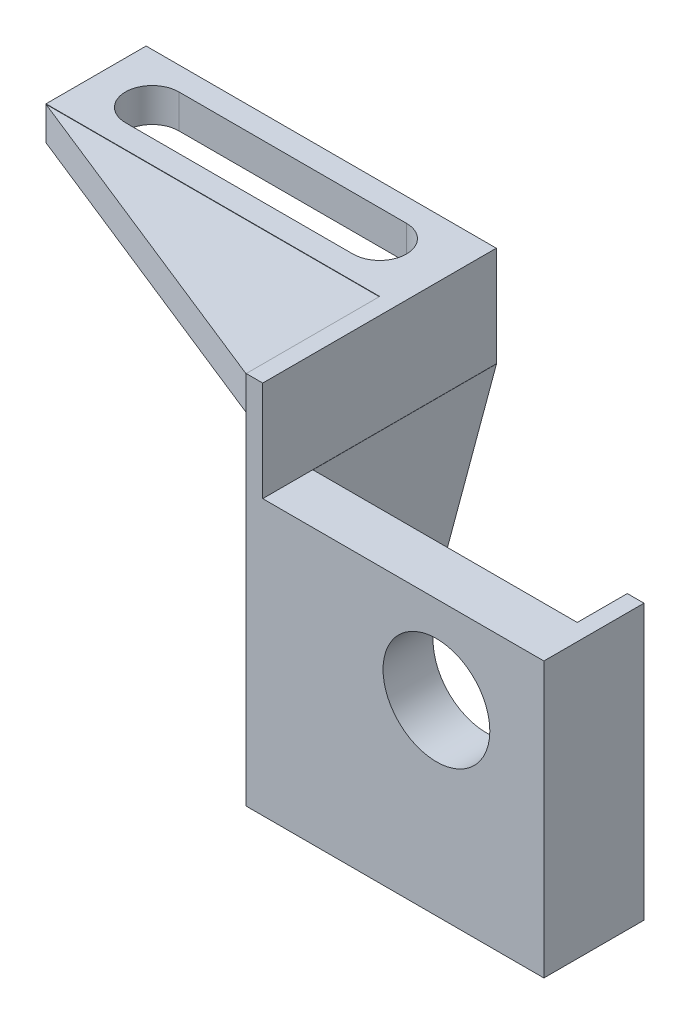
ISO-10303-21;
HEADER;
FILE_DESCRIPTION(('STEP AP214'),'2;1');
FILE_NAME('part.step','',(''),(''),'','','');
FILE_SCHEMA(('AUTOMOTIVE_DESIGN { 1 0 10303 214 1 1 1 1 }'));
ENDSEC;
DATA;
#1=APPLICATION_CONTEXT('core data for automotive mechanical design processes');
#2=APPLICATION_PROTOCOL_DEFINITION('international standard','automotive_design',2000,#1);
#3=PRODUCT_CONTEXT('',#1,'mechanical');
#4=PRODUCT('Part','Part','',(#3));
#5=PRODUCT_RELATED_PRODUCT_CATEGORY('part','',(#4));
#6=PRODUCT_DEFINITION_FORMATION('','',#4);
#7=PRODUCT_DEFINITION_CONTEXT('part definition',#1,'design');
#8=PRODUCT_DEFINITION('design','',#6,#7);
#9=PRODUCT_DEFINITION_SHAPE('','',#8);
#10=(LENGTH_UNIT() NAMED_UNIT(*) SI_UNIT(.MILLI.,.METRE.));
#11=(NAMED_UNIT(*) PLANE_ANGLE_UNIT() SI_UNIT($,.RADIAN.));
#12=(NAMED_UNIT(*) SI_UNIT($,.STERADIAN.) SOLID_ANGLE_UNIT());
#13=UNCERTAINTY_MEASURE_WITH_UNIT(LENGTH_MEASURE(1.E-05),#10,'distance_accuracy_value','');
#14=(GEOMETRIC_REPRESENTATION_CONTEXT(3) GLOBAL_UNCERTAINTY_ASSIGNED_CONTEXT((#13)) GLOBAL_UNIT_ASSIGNED_CONTEXT((#10,
#11,#12)) REPRESENTATION_CONTEXT('',''));
#15=CARTESIAN_POINT('',(0.,0.,0.));
#16=DIRECTION('',(0.,0.,1.));
#17=DIRECTION('',(1.,0.,0.));
#18=AXIS2_PLACEMENT_3D('',#15,#16,#17);
#19=CARTESIAN_POINT('',(-10.5238211552799,0.,0.));
#20=DIRECTION('',(-1.,0.,0.));
#21=DIRECTION('',(0.,-1.,0.));
#22=AXIS2_PLACEMENT_3D('',#19,#20,#21);
#23=PLANE('',#22);
#24=DIRECTION('',(0.,1.,0.));
#25=VECTOR('',#24,1.);
#26=CARTESIAN_POINT('',(-10.5238211552799,7.3452534562212,3.));
#27=LINE('',#26,#25);
#28=CARTESIAN_POINT('',(-10.5238211552799,-9.1097465437788,3.));
#29=VERTEX_POINT('',#28);
#30=CARTESIAN_POINT('',(-10.5238211552799,11.3211667033944,3.));
#31=VERTEX_POINT('',#30);
#32=EDGE_CURVE('E284',#29,#31,#27,.T.);
#33=ORIENTED_EDGE('',*,*,#32,.T.);
#34=DIRECTION('',(0.,0.,1.));
#35=VECTOR('',#34,1.);
#36=CARTESIAN_POINT('',(-10.5238211552799,11.3211667033944,-11.));
#37=LINE('',#36,#35);
#38=CARTESIAN_POINT('',(-10.5238211552799,11.3211667033944,-11.));
#39=VERTEX_POINT('',#38);
#40=EDGE_CURVE('E204',#39,#31,#37,.T.);
#41=ORIENTED_EDGE('',*,*,#40,.F.);
#42=DIRECTION('',(0.,1.,0.));
#43=VECTOR('',#42,1.);
#44=CARTESIAN_POINT('',(-10.5238211552799,13.3452534562212,-11.));
#45=LINE('',#44,#43);
#46=CARTESIAN_POINT('',(-10.5238211552799,7.3452534562212,-11.));
#47=VERTEX_POINT('',#46);
#48=EDGE_CURVE('E242',#47,#39,#45,.T.);
#49=ORIENTED_EDGE('',*,*,#48,.F.);
#50=DIRECTION('',(0.,-0.939493001584619,0.342568095381812));
#51=VECTOR('',#50,1.);
#52=CARTESIAN_POINT('',(-10.5238211552799,7.3452534562212,-11.));
#53=LINE('',#52,#51);
#54=CARTESIAN_POINT('',(-10.5238211552799,-9.1097465437788,-5.));
#55=VERTEX_POINT('',#54);
#56=EDGE_CURVE('E223',#47,#55,#53,.T.);
#57=ORIENTED_EDGE('',*,*,#56,.T.);
#58=DIRECTION('',(0.,0.,1.));
#59=VECTOR('',#58,1.);
#60=CARTESIAN_POINT('',(-10.5238211552799,-9.1097465437788,0.));
#61=LINE('',#60,#59);
#62=EDGE_CURVE('E279',#55,#29,#61,.T.);
#63=ORIENTED_EDGE('',*,*,#62,.T.);
#64=EDGE_LOOP('',(#33,#41,#49,#57,#63));
#65=FACE_BOUND('',#64,.T.);
#66=ADVANCED_FACE('F47',(#65),#23,.T.);
#67=CARTESIAN_POINT('',(0.,0.,0.));
#68=DIRECTION('',(0.,0.,1.));
#69=DIRECTION('',(1.,0.,0.));
#70=AXIS2_PLACEMENT_3D('',#67,#68,#69);
#71=PLANE('',#70);
#72=CARTESIAN_POINT('',(0.876178844720053,2.0902534562212,0.));
#73=DIRECTION('',(0.,0.,1.));
#74=DIRECTION('',(1.,0.,0.));
#75=AXIS2_PLACEMENT_3D('',#72,#73,#74);
#76=CIRCLE('',#75,3.2);
#77=CARTESIAN_POINT('',(4.07617884472005,2.0902534562212,0.));
#78=VERTEX_POINT('',#77);
#79=EDGE_CURVE('E297',#78,#78,#76,.T.);
#80=ORIENTED_EDGE('',*,*,#79,.T.);
#81=EDGE_LOOP('',(#80));
#82=FACE_BOUND('',#81,.T.);
#83=CARTESIAN_POINT('',(0.876178844720052,-6.0797465437788,0.));
#84=DIRECTION('',(0.,0.,1.));
#85=DIRECTION('',(1.,0.,0.));
#86=AXIS2_PLACEMENT_3D('',#83,#84,#85);
#87=CIRCLE('',#86,1.65);
#88=CARTESIAN_POINT('',(2.52617884472005,-6.0797465437788,0.));
#89=VERTEX_POINT('',#88);
#90=EDGE_CURVE('E11',#89,#89,#87,.F.);
#91=ORIENTED_EDGE('',*,*,#90,.F.);
#92=EDGE_LOOP('',(#91));
#93=FACE_BOUND('',#92,.T.);
#94=DIRECTION('',(0.,1.,0.));
#95=VECTOR('',#94,1.);
#96=CARTESIAN_POINT('',(6.31617884472005,7.3452534562212,0.));
#97=LINE('',#96,#95);
#98=CARTESIAN_POINT('',(6.31617884472005,-9.1097465437788,0.));
#99=VERTEX_POINT('',#98);
#100=CARTESIAN_POINT('',(6.31617884472005,7.3452534562212,0.));
#101=VERTEX_POINT('',#100);
#102=EDGE_CURVE('E327',#99,#101,#97,.T.);
#103=ORIENTED_EDGE('',*,*,#102,.F.);
#104=DIRECTION('',(1.,0.,0.));
#105=VECTOR('',#104,1.);
#106=CARTESIAN_POINT('',(-6.52382115527995,-9.1097465437788,0.));
#107=LINE('',#106,#105);
#108=CARTESIAN_POINT('',(-9.52382115527995,-9.1097465437788,0.));
#109=VERTEX_POINT('',#108);
#110=EDGE_CURVE('E293',#109,#99,#107,.T.);
#111=ORIENTED_EDGE('',*,*,#110,.F.);
#112=DIRECTION('',(0.,-1.,0.));
#113=VECTOR('',#112,1.);
#114=CARTESIAN_POINT('',(-9.52382115527995,7.3452534562212,0.));
#115=LINE('',#114,#113);
#116=CARTESIAN_POINT('',(-9.52382115527995,7.3452534562212,0.));
#117=VERTEX_POINT('',#116);
#118=EDGE_CURVE('E265',#117,#109,#115,.T.);
#119=ORIENTED_EDGE('',*,*,#118,.F.);
#120=DIRECTION('',(-1.,0.,0.));
#121=VECTOR('',#120,1.);
#122=CARTESIAN_POINT('',(-6.52382115527995,7.3452534562212,0.));
#123=LINE('',#122,#121);
#124=EDGE_CURVE('E304',#101,#117,#123,.T.);
#125=ORIENTED_EDGE('',*,*,#124,.F.);
#126=EDGE_LOOP('',(#103,#111,#119,#125));
#127=FACE_BOUND('',#126,.T.);
#128=ADVANCED_FACE('F326',(#82,#93,#127),#71,.F.);
#129=CARTESIAN_POINT('',(-6.52382115527995,7.3452534562212,3.));
#130=DIRECTION('',(0.,-1.,0.));
#131=DIRECTION('',(0.,0.,-1.));
#132=AXIS2_PLACEMENT_3D('',#129,#130,#131);
#133=PLANE('',#132);
#134=DIRECTION('',(0.,0.,-1.));
#135=VECTOR('',#134,1.);
#136=CARTESIAN_POINT('',(-9.53552980491728,7.3452534562212,-5.));
#137=LINE('',#136,#135);
#138=CARTESIAN_POINT('',(-9.53552980491728,7.3452534562212,3.));
#139=VERTEX_POINT('',#138);
#140=CARTESIAN_POINT('',(-9.53552980491728,7.3452534562212,-11.));
#141=VERTEX_POINT('',#140);
#142=EDGE_CURVE('E250',#139,#141,#137,.T.);
#143=ORIENTED_EDGE('',*,*,#142,.F.);
#144=DIRECTION('',(-1.,0.,0.));
#145=VECTOR('',#144,1.);
#146=CARTESIAN_POINT('',(-6.52382115527995,7.3452534562212,3.));
#147=LINE('',#146,#145);
#148=CARTESIAN_POINT('',(7.31617884472005,7.3452534562212,3.));
#149=VERTEX_POINT('',#148);
#150=EDGE_CURVE('E56',#149,#139,#147,.T.);
#151=ORIENTED_EDGE('',*,*,#150,.F.);
#152=DIRECTION('',(0.,0.,1.));
#153=VECTOR('',#152,1.);
#154=CARTESIAN_POINT('',(7.31617884472005,7.3452534562212,3.));
#155=LINE('',#154,#153);
#156=CARTESIAN_POINT('',(7.31617884472005,7.3452534562212,-3.));
#157=VERTEX_POINT('',#156);
#158=EDGE_CURVE('E379',#157,#149,#155,.T.);
#159=ORIENTED_EDGE('',*,*,#158,.F.);
#160=DIRECTION('',(1.,0.,0.));
#161=VECTOR('',#160,1.);
#162=CARTESIAN_POINT('',(7.31617884472005,7.3452534562212,-3.));
#163=LINE('',#162,#161);
#164=CARTESIAN_POINT('',(6.31617884472005,7.3452534562212,-3.));
#165=VERTEX_POINT('',#164);
#166=EDGE_CURVE('E777',#165,#157,#163,.T.);
#167=ORIENTED_EDGE('',*,*,#166,.F.);
#168=DIRECTION('',(0.,0.,1.));
#169=VECTOR('',#168,1.);
#170=CARTESIAN_POINT('',(6.31617884472005,7.3452534562212,-3.));
#171=LINE('',#170,#169);
#172=EDGE_CURVE('E317',#165,#101,#171,.T.);
#173=ORIENTED_EDGE('',*,*,#172,.T.);
#174=ORIENTED_EDGE('',*,*,#124,.T.);
#175=DIRECTION('',(0.,0.,1.));
#176=VECTOR('',#175,1.);
#177=CARTESIAN_POINT('',(-9.52382115527995,7.3452534562212,-5.));
#178=LINE('',#177,#176);
#179=CARTESIAN_POINT('',(-9.52382115527995,7.3452534562212,-11.));
#180=VERTEX_POINT('',#179);
#181=EDGE_CURVE('E275',#180,#117,#178,.T.);
#182=ORIENTED_EDGE('',*,*,#181,.F.);
#183=DIRECTION('',(-1.,0.,0.));
#184=VECTOR('',#183,1.);
#185=CARTESIAN_POINT('',(-9.52382115527995,7.3452534562212,-11.));
#186=LINE('',#185,#184);
#187=EDGE_CURVE('E227',#180,#141,#186,.T.);
#188=ORIENTED_EDGE('',*,*,#187,.T.);
#189=EDGE_LOOP('',(#143,#151,#159,#167,#173,#174,#182,#188));
#190=FACE_BOUND('',#189,.T.);
#191=ADVANCED_FACE('F49',(#190),#133,.F.);
#192=CARTESIAN_POINT('',(0.,0.,3.));
#193=DIRECTION('',(0.,0.,1.));
#194=DIRECTION('',(1.,0.,0.));
#195=AXIS2_PLACEMENT_3D('',#192,#193,#194);
#196=PLANE('',#195);
#197=DIRECTION('',(1.,0.,0.));
#198=VECTOR('',#197,1.);
#199=CARTESIAN_POINT('',(-6.52382115527995,-9.1097465437788,3.));
#200=LINE('',#199,#198);
#201=CARTESIAN_POINT('',(7.31617884472005,-9.1097465437788,3.));
#202=VERTEX_POINT('',#201);
#203=EDGE_CURVE('E292',#29,#202,#200,.T.);
#204=ORIENTED_EDGE('',*,*,#203,.T.);
#205=DIRECTION('',(0.,-1.,0.));
#206=VECTOR('',#205,1.);
#207=CARTESIAN_POINT('',(7.31617884472005,7.3452534562212,3.));
#208=LINE('',#207,#206);
#209=EDGE_CURVE('E372',#149,#202,#208,.T.);
#210=ORIENTED_EDGE('',*,*,#209,.F.);
#211=ORIENTED_EDGE('',*,*,#150,.T.);
#212=DIRECTION('',(0.,-1.,0.));
#213=VECTOR('',#212,1.);
#214=CARTESIAN_POINT('',(-9.53552980491728,13.3452534562212,3.));
#215=LINE('',#214,#213);
#216=CARTESIAN_POINT('',(-9.53552980491728,13.3452534562212,3.));
#217=VERTEX_POINT('',#216);
#218=EDGE_CURVE('E259',#217,#139,#215,.T.);
#219=ORIENTED_EDGE('',*,*,#218,.F.);
#220=DIRECTION('',(1.,0.,0.));
#221=VECTOR('',#220,1.);
#222=CARTESIAN_POINT('',(-10.5238211552799,13.3452534562212,3.));
#223=LINE('',#222,#221);
#224=CARTESIAN_POINT('',(-10.5238211552799,13.3452534562212,3.));
#225=VERTEX_POINT('',#224);
#226=EDGE_CURVE('E253',#225,#217,#223,.T.);
#227=ORIENTED_EDGE('',*,*,#226,.F.);
#228=CARTESIAN_POINT('',(-10.5238211552799,13.3211667033944,3.));
#229=VERTEX_POINT('',#228);
#230=EDGE_CURVE('E283',#229,#225,#27,.T.);
#231=ORIENTED_EDGE('',*,*,#230,.F.);
#232=DIRECTION('',(0.,-1.,0.));
#233=VECTOR('',#232,1.);
#234=CARTESIAN_POINT('',(-10.5238211552799,13.3211667033944,3.));
#235=LINE('',#234,#233);
#236=EDGE_CURVE('E187',#229,#31,#235,.T.);
#237=ORIENTED_EDGE('',*,*,#236,.T.);
#238=ORIENTED_EDGE('',*,*,#32,.F.);
#239=EDGE_LOOP('',(#204,#210,#211,#219,#227,#231,#237,#238));
#240=FACE_BOUND('',#239,.T.);
#241=CARTESIAN_POINT('',(0.876178844720053,2.0902534562212,3.));
#242=DIRECTION('',(0.,0.,1.));
#243=DIRECTION('',(1.,0.,0.));
#244=AXIS2_PLACEMENT_3D('',#241,#242,#243);
#245=CIRCLE('',#244,3.2);
#246=CARTESIAN_POINT('',(4.07617884472005,2.0902534562212,3.));
#247=VERTEX_POINT('',#246);
#248=EDGE_CURVE('E300',#247,#247,#245,.T.);
#249=ORIENTED_EDGE('',*,*,#248,.F.);
#250=EDGE_LOOP('',(#249));
#251=FACE_BOUND('',#250,.T.);
#252=ADVANCED_FACE('F368',(#240,#251),#196,.T.);
#253=CARTESIAN_POINT('',(0.876178844720053,2.0902534562212,3.));
#254=DIRECTION('',(0.,0.,-1.));
#255=DIRECTION('',(-1.,0.,0.));
#256=AXIS2_PLACEMENT_3D('',#253,#254,#255);
#257=CYLINDRICAL_SURFACE('',#256,3.2);
#258=ORIENTED_EDGE('',*,*,#248,.T.);
#259=EDGE_LOOP('',(#258));
#260=FACE_BOUND('',#259,.T.);
#261=ORIENTED_EDGE('',*,*,#79,.F.);
#262=EDGE_LOOP('',(#261));
#263=FACE_BOUND('',#262,.T.);
#264=ADVANCED_FACE('F469',(#260,#263),#257,.F.);
#265=CARTESIAN_POINT('',(-6.52382115527995,-9.1097465437788,0.));
#266=DIRECTION('',(0.,-1.,0.));
#267=DIRECTION('',(0.,0.,-1.));
#268=AXIS2_PLACEMENT_3D('',#265,#266,#267);
#269=PLANE('',#268);
#270=DIRECTION('',(0.,0.,-1.));
#271=VECTOR('',#270,1.);
#272=CARTESIAN_POINT('',(7.31617884472005,-9.1097465437788,3.));
#273=LINE('',#272,#271);
#274=CARTESIAN_POINT('',(7.31617884472005,-9.1097465437788,-3.));
#275=VERTEX_POINT('',#274);
#276=EDGE_CURVE('E375',#202,#275,#273,.T.);
#277=ORIENTED_EDGE('',*,*,#276,.F.);
#278=ORIENTED_EDGE('',*,*,#203,.F.);
#279=ORIENTED_EDGE('',*,*,#62,.F.);
#280=DIRECTION('',(-1.,0.,0.));
#281=VECTOR('',#280,1.);
#282=CARTESIAN_POINT('',(-10.5238211552799,-9.1097465437788,-5.));
#283=LINE('',#282,#281);
#284=CARTESIAN_POINT('',(-9.52382115527995,-9.1097465437788,-5.));
#285=VERTEX_POINT('',#284);
#286=EDGE_CURVE('E266',#285,#55,#283,.T.);
#287=ORIENTED_EDGE('',*,*,#286,.F.);
#288=DIRECTION('',(0.,0.,1.));
#289=VECTOR('',#288,1.);
#290=CARTESIAN_POINT('',(-9.52382115527995,-9.1097465437788,-5.));
#291=LINE('',#290,#289);
#292=EDGE_CURVE('E269',#285,#109,#291,.T.);
#293=ORIENTED_EDGE('',*,*,#292,.T.);
#294=ORIENTED_EDGE('',*,*,#110,.T.);
#295=DIRECTION('',(0.,0.,1.));
#296=VECTOR('',#295,1.);
#297=CARTESIAN_POINT('',(6.31617884472005,-9.1097465437788,-3.));
#298=LINE('',#297,#296);
#299=CARTESIAN_POINT('',(6.31617884472005,-9.1097465437788,-3.));
#300=VERTEX_POINT('',#299);
#301=EDGE_CURVE('E333',#300,#99,#298,.T.);
#302=ORIENTED_EDGE('',*,*,#301,.F.);
#303=DIRECTION('',(-1.,0.,0.));
#304=VECTOR('',#303,1.);
#305=CARTESIAN_POINT('',(7.31617884472005,-9.1097465437788,-3.));
#306=LINE('',#305,#304);
#307=EDGE_CURVE('E771',#275,#300,#306,.T.);
#308=ORIENTED_EDGE('',*,*,#307,.F.);
#309=EDGE_LOOP('',(#277,#278,#279,#287,#293,#294,#302,#308));
#310=FACE_BOUND('',#309,.T.);
#311=ADVANCED_FACE('F331',(#310),#269,.T.);
#312=CARTESIAN_POINT('',(0.876178844720052,-6.0797465437788,-3.));
#313=DIRECTION('',(0.,0.,1.));
#314=DIRECTION('',(1.,0.,0.));
#315=AXIS2_PLACEMENT_3D('',#312,#313,#314);
#316=CYLINDRICAL_SURFACE('',#315,1.65);
#317=CARTESIAN_POINT('',(0.876178844720052,-6.0797465437788,-3.));
#318=DIRECTION('',(0.,0.,-1.));
#319=DIRECTION('',(-1.,0.,0.));
#320=AXIS2_PLACEMENT_3D('',#317,#318,#319);
#321=CIRCLE('',#320,1.65);
#322=CARTESIAN_POINT('',(-0.773821155279948,-6.0797465437788,-3.));
#323=VERTEX_POINT('',#322);
#324=EDGE_CURVE('E288',#323,#323,#321,.T.);
#325=ORIENTED_EDGE('',*,*,#324,.F.);
#326=EDGE_LOOP('',(#325));
#327=FACE_BOUND('',#326,.T.);
#328=ORIENTED_EDGE('',*,*,#90,.T.);
#329=EDGE_LOOP('',(#328));
#330=FACE_BOUND('',#329,.T.);
#331=ADVANCED_FACE('F459',(#327,#330),#316,.T.);
#332=CARTESIAN_POINT('',(0.876178844720052,-6.0797465437788,-3.));
#333=DIRECTION('',(0.,0.,-1.));
#334=DIRECTION('',(-1.,0.,0.));
#335=AXIS2_PLACEMENT_3D('',#332,#333,#334);
#336=PLANE('',#335);
#337=ORIENTED_EDGE('',*,*,#324,.T.);
#338=EDGE_LOOP('',(#337));
#339=FACE_BOUND('',#338,.T.);
#340=ADVANCED_FACE('F453',(#339),#336,.T.);
#341=DIRECTION('',(0.,0.,1.));
#342=VECTOR('',#341,1.);
#343=CARTESIAN_POINT('',(-10.5238211552799,13.3211667033944,-5.));
#344=LINE('',#343,#342);
#345=CARTESIAN_POINT('',(-10.5238211552799,13.3211667033944,-5.));
#346=VERTEX_POINT('',#345);
#347=EDGE_CURVE('E178',#346,#229,#344,.T.);
#348=ORIENTED_EDGE('',*,*,#347,.T.);
#349=ORIENTED_EDGE('',*,*,#230,.T.);
#350=DIRECTION('',(0.,0.,1.));
#351=VECTOR('',#350,1.);
#352=CARTESIAN_POINT('',(-10.5238211552799,13.3452534562212,-5.));
#353=LINE('',#352,#351);
#354=CARTESIAN_POINT('',(-10.5238211552799,13.3452534562212,-5.));
#355=VERTEX_POINT('',#354);
#356=EDGE_CURVE('E200',#355,#225,#353,.T.);
#357=ORIENTED_EDGE('',*,*,#356,.F.);
#358=DIRECTION('',(0.,1.,0.));
#359=VECTOR('',#358,1.);
#360=CARTESIAN_POINT('',(-10.5238211552799,13.3452534562212,-5.));
#361=LINE('',#360,#359);
#362=EDGE_CURVE('E192',#346,#355,#361,.T.);
#363=ORIENTED_EDGE('',*,*,#362,.F.);
#364=EDGE_LOOP('',(#348,#349,#357,#363));
#365=FACE_BOUND('',#364,.T.);
#366=ADVANCED_FACE('F198',(#365),#23,.T.);
#367=CARTESIAN_POINT('',(-9.52382115527995,7.3452534562212,-5.));
#368=DIRECTION('',(-1.,0.,0.));
#369=DIRECTION('',(0.,-1.,0.));
#370=AXIS2_PLACEMENT_3D('',#367,#368,#369);
#371=PLANE('',#370);
#372=ORIENTED_EDGE('',*,*,#118,.T.);
#373=ORIENTED_EDGE('',*,*,#292,.F.);
#374=DIRECTION('',(0.,-0.939493001584619,0.342568095381812));
#375=VECTOR('',#374,1.);
#376=CARTESIAN_POINT('',(-9.52382115527995,7.3452534562212,-11.));
#377=LINE('',#376,#375);
#378=EDGE_CURVE('E224',#180,#285,#377,.T.);
#379=ORIENTED_EDGE('',*,*,#378,.F.);
#380=ORIENTED_EDGE('',*,*,#181,.T.);
#381=EDGE_LOOP('',(#372,#373,#379,#380));
#382=FACE_BOUND('',#381,.T.);
#383=ADVANCED_FACE('F323',(#382),#371,.F.);
#384=CARTESIAN_POINT('',(-9.53552980491728,13.3452534562212,-5.));
#385=DIRECTION('',(-1.,0.,0.));
#386=DIRECTION('',(0.,0.,1.));
#387=AXIS2_PLACEMENT_3D('',#384,#385,#386);
#388=PLANE('',#387);
#389=ORIENTED_EDGE('',*,*,#142,.T.);
#390=DIRECTION('',(0.,-1.,0.));
#391=VECTOR('',#390,1.);
#392=CARTESIAN_POINT('',(-9.53552980491728,13.3452534562212,-11.));
#393=LINE('',#392,#391);
#394=CARTESIAN_POINT('',(-9.53552980491728,13.3452534562212,-11.));
#395=VERTEX_POINT('',#394);
#396=EDGE_CURVE('E234',#395,#141,#393,.T.);
#397=ORIENTED_EDGE('',*,*,#396,.F.);
#398=DIRECTION('',(0.,0.,-1.));
#399=VECTOR('',#398,1.);
#400=CARTESIAN_POINT('',(-9.53552980491728,13.3452534562212,-5.));
#401=LINE('',#400,#399);
#402=EDGE_CURVE('E256',#217,#395,#401,.T.);
#403=ORIENTED_EDGE('',*,*,#402,.F.);
#404=ORIENTED_EDGE('',*,*,#218,.T.);
#405=EDGE_LOOP('',(#389,#397,#403,#404));
#406=FACE_BOUND('',#405,.T.);
#407=ADVANCED_FACE('F363',(#406),#388,.F.);
#408=CARTESIAN_POINT('',(0.,13.3452534562212,0.));
#409=DIRECTION('',(0.,1.,0.));
#410=DIRECTION('',(0.,0.,1.));
#411=AXIS2_PLACEMENT_3D('',#408,#409,#410);
#412=PLANE('',#411);
#413=CARTESIAN_POINT('',(-27.1601684994717,13.3452534562212,-8.));
#414=DIRECTION('',(0.,-1.,0.));
#415=DIRECTION('',(1.,0.,0.));
#416=AXIS2_PLACEMENT_3D('',#413,#414,#415);
#417=CIRCLE('',#416,1.6);
#418=CARTESIAN_POINT('',(-27.1601684994717,13.3452534562212,-6.4));
#419=VERTEX_POINT('',#418);
#420=CARTESIAN_POINT('',(-27.1601684994717,13.3452534562212,-9.6));
#421=VERTEX_POINT('',#420);
#422=EDGE_CURVE('E387',#419,#421,#417,.T.);
#423=ORIENTED_EDGE('',*,*,#422,.T.);
#424=DIRECTION('',(1.,0.,0.));
#425=VECTOR('',#424,1.);
#426=CARTESIAN_POINT('',(-27.1601684994717,13.3452534562212,-9.6));
#427=LINE('',#426,#425);
#428=CARTESIAN_POINT('',(-13.5238211552799,13.3452534562212,-9.6));
#429=VERTEX_POINT('',#428);
#430=EDGE_CURVE('E391',#421,#429,#427,.T.);
#431=ORIENTED_EDGE('',*,*,#430,.T.);
#432=CARTESIAN_POINT('',(-13.5238211552799,13.3452534562212,-8.));
#433=DIRECTION('',(0.,-1.,0.));
#434=DIRECTION('',(1.,0.,0.));
#435=AXIS2_PLACEMENT_3D('',#432,#433,#434);
#436=CIRCLE('',#435,1.6);
#437=CARTESIAN_POINT('',(-13.5238211552799,13.3452534562212,-6.4));
#438=VERTEX_POINT('',#437);
#439=EDGE_CURVE('E71',#429,#438,#436,.T.);
#440=ORIENTED_EDGE('',*,*,#439,.T.);
#441=DIRECTION('',(-1.,0.,0.));
#442=VECTOR('',#441,1.);
#443=CARTESIAN_POINT('',(-27.1601684994717,13.3452534562212,-6.4));
#444=LINE('',#443,#442);
#445=EDGE_CURVE('E398',#438,#419,#444,.T.);
#446=ORIENTED_EDGE('',*,*,#445,.T.);
#447=EDGE_LOOP('',(#423,#431,#440,#446));
#448=FACE_BOUND('',#447,.T.);
#449=DIRECTION('',(1.,0.,0.));
#450=VECTOR('',#449,1.);
#451=CARTESIAN_POINT('',(-9.53552980491728,13.3452534562212,-11.));
#452=LINE('',#451,#450);
#453=CARTESIAN_POINT('',(-30.5238211552799,13.3452534562212,-11.));
#454=VERTEX_POINT('',#453);
#455=EDGE_CURVE('E246',#454,#395,#452,.T.);
#456=ORIENTED_EDGE('',*,*,#455,.F.);
#457=DIRECTION('',(0.,0.,-1.));
#458=VECTOR('',#457,1.);
#459=CARTESIAN_POINT('',(-30.5238211552799,13.3452534562212,-11.));
#460=LINE('',#459,#458);
#461=CARTESIAN_POINT('',(-30.5238211552799,13.3452534562212,-5.));
#462=VERTEX_POINT('',#461);
#463=EDGE_CURVE('E219',#462,#454,#460,.T.);
#464=ORIENTED_EDGE('',*,*,#463,.F.);
#465=DIRECTION('',(1.,0.,0.));
#466=VECTOR('',#465,1.);
#467=CARTESIAN_POINT('',(-30.5238211552799,13.3452534562212,-5.));
#468=LINE('',#467,#466);
#469=EDGE_CURVE('E215',#462,#355,#468,.T.);
#470=ORIENTED_EDGE('',*,*,#469,.T.);
#471=ORIENTED_EDGE('',*,*,#356,.T.);
#472=ORIENTED_EDGE('',*,*,#226,.T.);
#473=ORIENTED_EDGE('',*,*,#402,.T.);
#474=EDGE_LOOP('',(#456,#464,#470,#471,#472,#473));
#475=FACE_BOUND('',#474,.T.);
#476=ADVANCED_FACE('F431',(#448,#475),#412,.T.);
#477=CARTESIAN_POINT('',(0.,0.,-11.));
#478=DIRECTION('',(0.,0.,-1.));
#479=DIRECTION('',(-1.,0.,0.));
#480=AXIS2_PLACEMENT_3D('',#477,#478,#479);
#481=PLANE('',#480);
#482=ORIENTED_EDGE('',*,*,#396,.T.);
#483=DIRECTION('',(-1.,0.,0.));
#484=VECTOR('',#483,1.);
#485=CARTESIAN_POINT('',(-9.53552980491728,7.3452534562212,-11.));
#486=LINE('',#485,#484);
#487=EDGE_CURVE('E238',#141,#47,#486,.T.);
#488=ORIENTED_EDGE('',*,*,#487,.T.);
#489=ORIENTED_EDGE('',*,*,#48,.T.);
#490=DIRECTION('',(1.,0.,0.));
#491=VECTOR('',#490,1.);
#492=CARTESIAN_POINT('',(-30.5238211552799,11.3211667033944,-11.));
#493=LINE('',#492,#491);
#494=CARTESIAN_POINT('',(-30.5238211552799,11.3211667033944,-11.));
#495=VERTEX_POINT('',#494);
#496=EDGE_CURVE('E218',#495,#39,#493,.T.);
#497=ORIENTED_EDGE('',*,*,#496,.F.);
#498=DIRECTION('',(0.,-1.,0.));
#499=VECTOR('',#498,1.);
#500=CARTESIAN_POINT('',(-30.5238211552799,13.3452534562212,-11.));
#501=LINE('',#500,#499);
#502=EDGE_CURVE('E203',#454,#495,#501,.T.);
#503=ORIENTED_EDGE('',*,*,#502,.F.);
#504=ORIENTED_EDGE('',*,*,#455,.T.);
#505=EDGE_LOOP('',(#482,#488,#489,#497,#503,#504));
#506=FACE_BOUND('',#505,.T.);
#507=ADVANCED_FACE('F345',(#506),#481,.T.);
#508=CARTESIAN_POINT('',(-9.52382115527995,7.3452534562212,-11.));
#509=DIRECTION('',(0.,-0.342568095381812,-0.93949300158462));
#510=DIRECTION('',(0.,0.93949300158462,-0.342568095381812));
#511=AXIS2_PLACEMENT_3D('',#508,#509,#510);
#512=PLANE('',#511);
#513=ORIENTED_EDGE('',*,*,#56,.F.);
#514=ORIENTED_EDGE('',*,*,#487,.F.);
#515=ORIENTED_EDGE('',*,*,#187,.F.);
#516=ORIENTED_EDGE('',*,*,#378,.T.);
#517=ORIENTED_EDGE('',*,*,#286,.T.);
#518=EDGE_LOOP('',(#513,#514,#515,#516,#517));
#519=FACE_BOUND('',#518,.T.);
#520=ADVANCED_FACE('F338',(#519),#512,.T.);
#521=CARTESIAN_POINT('',(-30.5238211552799,11.3211667033944,-11.));
#522=DIRECTION('',(0.,1.,0.));
#523=DIRECTION('',(-1.,0.,0.));
#524=AXIS2_PLACEMENT_3D('',#521,#522,#523);
#525=PLANE('',#524);
#526=DIRECTION('',(1.,0.,0.));
#527=VECTOR('',#526,1.);
#528=CARTESIAN_POINT('',(-27.1601684994717,11.3211667033944,-9.6));
#529=LINE('',#528,#527);
#530=CARTESIAN_POINT('',(-27.1601684994717,11.3211667033944,-9.6));
#531=VERTEX_POINT('',#530);
#532=CARTESIAN_POINT('',(-13.5238211552799,11.3211667033944,-9.6));
#533=VERTEX_POINT('',#532);
#534=EDGE_CURVE('E405',#531,#533,#529,.T.);
#535=ORIENTED_EDGE('',*,*,#534,.F.);
#536=CARTESIAN_POINT('',(-27.1601684994717,11.3211667033944,-8.));
#537=DIRECTION('',(0.,-1.,0.));
#538=DIRECTION('',(1.,0.,0.));
#539=AXIS2_PLACEMENT_3D('',#536,#537,#538);
#540=CIRCLE('',#539,1.6);
#541=CARTESIAN_POINT('',(-27.1601684994717,11.3211667033944,-6.4));
#542=VERTEX_POINT('',#541);
#543=EDGE_CURVE('E386',#542,#531,#540,.T.);
#544=ORIENTED_EDGE('',*,*,#543,.F.);
#545=DIRECTION('',(-1.,0.,0.));
#546=VECTOR('',#545,1.);
#547=CARTESIAN_POINT('',(-27.1601684994717,11.3211667033944,-6.4));
#548=LINE('',#547,#546);
#549=CARTESIAN_POINT('',(-13.5238211552799,11.3211667033944,-6.4));
#550=VERTEX_POINT('',#549);
#551=EDGE_CURVE('E392',#550,#542,#548,.T.);
#552=ORIENTED_EDGE('',*,*,#551,.F.);
#553=CARTESIAN_POINT('',(-13.5238211552799,11.3211667033944,-8.));
#554=DIRECTION('',(0.,-1.,0.));
#555=DIRECTION('',(1.,0.,0.));
#556=AXIS2_PLACEMENT_3D('',#553,#554,#555);
#557=CIRCLE('',#556,1.6);
#558=EDGE_CURVE('E409',#533,#550,#557,.T.);
#559=ORIENTED_EDGE('',*,*,#558,.F.);
#560=EDGE_LOOP('',(#535,#544,#552,#559));
#561=FACE_BOUND('',#560,.T.);
#562=ORIENTED_EDGE('',*,*,#40,.T.);
#563=DIRECTION('',(-0.928476690885259,0.,-0.371390676354104));
#564=VECTOR('',#563,1.);
#565=CARTESIAN_POINT('',(-10.5238211552799,11.3211667033944,3.));
#566=LINE('',#565,#564);
#567=CARTESIAN_POINT('',(-30.5238211552799,11.3211667033944,-5.));
#568=VERTEX_POINT('',#567);
#569=EDGE_CURVE('E352',#31,#568,#566,.T.);
#570=ORIENTED_EDGE('',*,*,#569,.T.);
#571=DIRECTION('',(0.,0.,1.));
#572=VECTOR('',#571,1.);
#573=CARTESIAN_POINT('',(-30.5238211552799,11.3211667033944,-11.));
#574=LINE('',#573,#572);
#575=EDGE_CURVE('E209',#495,#568,#574,.T.);
#576=ORIENTED_EDGE('',*,*,#575,.F.);
#577=ORIENTED_EDGE('',*,*,#496,.T.);
#578=EDGE_LOOP('',(#562,#570,#576,#577));
#579=FACE_BOUND('',#578,.T.);
#580=ADVANCED_FACE('F348',(#561,#579),#525,.F.);
#581=CARTESIAN_POINT('',(-30.5238211552799,13.3452534562212,-5.));
#582=DIRECTION('',(0.,0.,-1.));
#583=DIRECTION('',(-1.,0.,0.));
#584=AXIS2_PLACEMENT_3D('',#581,#582,#583);
#585=PLANE('',#584);
#586=DIRECTION('',(0.,1.,0.));
#587=VECTOR('',#586,1.);
#588=CARTESIAN_POINT('',(-30.5238211552799,13.3452534562212,-5.));
#589=LINE('',#588,#587);
#590=CARTESIAN_POINT('',(-30.5238211552799,13.3211667033944,-5.));
#591=VERTEX_POINT('',#590);
#592=EDGE_CURVE('E194',#591,#462,#589,.T.);
#593=ORIENTED_EDGE('',*,*,#592,.F.);
#594=DIRECTION('',(1.,0.,0.));
#595=VECTOR('',#594,1.);
#596=CARTESIAN_POINT('',(-30.5238211552799,13.3211667033944,-5.));
#597=LINE('',#596,#595);
#598=EDGE_CURVE('E181',#591,#346,#597,.T.);
#599=ORIENTED_EDGE('',*,*,#598,.T.);
#600=ORIENTED_EDGE('',*,*,#362,.T.);
#601=ORIENTED_EDGE('',*,*,#469,.F.);
#602=EDGE_LOOP('',(#593,#599,#600,#601));
#603=FACE_BOUND('',#602,.T.);
#604=ADVANCED_FACE('F190',(#603),#585,.F.);
#605=CARTESIAN_POINT('',(-30.5238211552799,0.,0.));
#606=DIRECTION('',(-1.,0.,0.));
#607=DIRECTION('',(0.,0.,1.));
#608=AXIS2_PLACEMENT_3D('',#605,#606,#607);
#609=PLANE('',#608);
#610=ORIENTED_EDGE('',*,*,#502,.T.);
#611=ORIENTED_EDGE('',*,*,#575,.T.);
#612=EDGE_CURVE('E427',#568,#591,#589,.T.);
#613=ORIENTED_EDGE('',*,*,#612,.T.);
#614=ORIENTED_EDGE('',*,*,#592,.T.);
#615=ORIENTED_EDGE('',*,*,#463,.T.);
#616=EDGE_LOOP('',(#610,#611,#613,#614,#615));
#617=FACE_BOUND('',#616,.T.);
#618=ADVANCED_FACE('F357',(#617),#609,.T.);
#619=CARTESIAN_POINT('',(-27.1601684994717,13.3452534562212,-8.));
#620=DIRECTION('',(0.,-1.,0.));
#621=DIRECTION('',(1.,0.,0.));
#622=AXIS2_PLACEMENT_3D('',#619,#620,#621);
#623=CYLINDRICAL_SURFACE('',#622,1.6);
#624=ORIENTED_EDGE('',*,*,#543,.T.);
#625=DIRECTION('',(0.,-1.,0.));
#626=VECTOR('',#625,1.);
#627=CARTESIAN_POINT('',(-27.1601684994717,13.3452534562212,-9.6));
#628=LINE('',#627,#626);
#629=EDGE_CURVE('E402',#421,#531,#628,.T.);
#630=ORIENTED_EDGE('',*,*,#629,.F.);
#631=ORIENTED_EDGE('',*,*,#422,.F.);
#632=DIRECTION('',(0.,-1.,0.));
#633=VECTOR('',#632,1.);
#634=CARTESIAN_POINT('',(-27.1601684994717,13.3452534562212,-6.4));
#635=LINE('',#634,#633);
#636=EDGE_CURVE('E211',#419,#542,#635,.T.);
#637=ORIENTED_EDGE('',*,*,#636,.T.);
#638=EDGE_LOOP('',(#624,#630,#631,#637));
#639=FACE_BOUND('',#638,.T.);
#640=ADVANCED_FACE('F569',(#639),#623,.F.);
#641=CARTESIAN_POINT('',(-27.1601684994717,13.3452534562212,-6.4));
#642=DIRECTION('',(0.,0.,1.));
#643=DIRECTION('',(1.,0.,0.));
#644=AXIS2_PLACEMENT_3D('',#641,#642,#643);
#645=PLANE('',#644);
#646=ORIENTED_EDGE('',*,*,#551,.T.);
#647=ORIENTED_EDGE('',*,*,#636,.F.);
#648=ORIENTED_EDGE('',*,*,#445,.F.);
#649=DIRECTION('',(0.,-1.,0.));
#650=VECTOR('',#649,1.);
#651=CARTESIAN_POINT('',(-13.5238211552799,13.3452534562212,-6.4));
#652=LINE('',#651,#650);
#653=EDGE_CURVE('E418',#438,#550,#652,.T.);
#654=ORIENTED_EDGE('',*,*,#653,.T.);
#655=EDGE_LOOP('',(#646,#647,#648,#654));
#656=FACE_BOUND('',#655,.T.);
#657=ADVANCED_FACE('F565',(#656),#645,.F.);
#658=CARTESIAN_POINT('',(-13.5238211552799,13.3452534562212,-8.));
#659=DIRECTION('',(0.,-1.,0.));
#660=DIRECTION('',(1.,0.,0.));
#661=AXIS2_PLACEMENT_3D('',#658,#659,#660);
#662=CYLINDRICAL_SURFACE('',#661,1.6);
#663=ORIENTED_EDGE('',*,*,#558,.T.);
#664=ORIENTED_EDGE('',*,*,#653,.F.);
#665=ORIENTED_EDGE('',*,*,#439,.F.);
#666=DIRECTION('',(0.,-1.,0.));
#667=VECTOR('',#666,1.);
#668=CARTESIAN_POINT('',(-13.5238211552799,13.3452534562212,-9.6));
#669=LINE('',#668,#667);
#670=EDGE_CURVE('E421',#429,#533,#669,.T.);
#671=ORIENTED_EDGE('',*,*,#670,.T.);
#672=EDGE_LOOP('',(#663,#664,#665,#671));
#673=FACE_BOUND('',#672,.T.);
#674=ADVANCED_FACE('F568',(#673),#662,.F.);
#675=CARTESIAN_POINT('',(-27.1601684994717,13.3452534562212,-9.6));
#676=DIRECTION('',(0.,0.,-1.));
#677=DIRECTION('',(-1.,0.,0.));
#678=AXIS2_PLACEMENT_3D('',#675,#676,#677);
#679=PLANE('',#678);
#680=ORIENTED_EDGE('',*,*,#534,.T.);
#681=ORIENTED_EDGE('',*,*,#670,.F.);
#682=ORIENTED_EDGE('',*,*,#430,.F.);
#683=ORIENTED_EDGE('',*,*,#629,.T.);
#684=EDGE_LOOP('',(#680,#681,#682,#683));
#685=FACE_BOUND('',#684,.T.);
#686=ADVANCED_FACE('F496',(#685),#679,.F.);
#687=CARTESIAN_POINT('',(7.31617884472005,0.,0.));
#688=DIRECTION('',(1.,0.,0.));
#689=DIRECTION('',(0.,0.,-1.));
#690=AXIS2_PLACEMENT_3D('',#687,#688,#689);
#691=PLANE('',#690);
#692=ORIENTED_EDGE('',*,*,#209,.T.);
#693=ORIENTED_EDGE('',*,*,#276,.T.);
#694=DIRECTION('',(0.,-1.,0.));
#695=VECTOR('',#694,1.);
#696=CARTESIAN_POINT('',(7.31617884472005,7.3452534562212,-3.));
#697=LINE('',#696,#695);
#698=EDGE_CURVE('E765',#157,#275,#697,.T.);
#699=ORIENTED_EDGE('',*,*,#698,.F.);
#700=ORIENTED_EDGE('',*,*,#158,.T.);
#701=EDGE_LOOP('',(#692,#693,#699,#700));
#702=FACE_BOUND('',#701,.T.);
#703=ADVANCED_FACE('F492',(#702),#691,.T.);
#704=CARTESIAN_POINT('',(6.31617884472005,7.3452534562212,-3.));
#705=DIRECTION('',(1.,0.,0.));
#706=DIRECTION('',(0.,1.,0.));
#707=AXIS2_PLACEMENT_3D('',#704,#705,#706);
#708=PLANE('',#707);
#709=ORIENTED_EDGE('',*,*,#102,.T.);
#710=ORIENTED_EDGE('',*,*,#172,.F.);
#711=DIRECTION('',(0.,1.,0.));
#712=VECTOR('',#711,1.);
#713=CARTESIAN_POINT('',(6.31617884472005,7.3452534562212,-3.));
#714=LINE('',#713,#712);
#715=EDGE_CURVE('E774',#300,#165,#714,.T.);
#716=ORIENTED_EDGE('',*,*,#715,.F.);
#717=ORIENTED_EDGE('',*,*,#301,.T.);
#718=EDGE_LOOP('',(#709,#710,#716,#717));
#719=FACE_BOUND('',#718,.T.);
#720=ADVANCED_FACE('F495',(#719),#708,.F.);
#721=CARTESIAN_POINT('',(0.,0.,-3.));
#722=DIRECTION('',(0.,0.,-1.));
#723=DIRECTION('',(-1.,0.,0.));
#724=AXIS2_PLACEMENT_3D('',#721,#722,#723);
#725=PLANE('',#724);
#726=ORIENTED_EDGE('',*,*,#698,.T.);
#727=ORIENTED_EDGE('',*,*,#307,.T.);
#728=ORIENTED_EDGE('',*,*,#715,.T.);
#729=ORIENTED_EDGE('',*,*,#166,.T.);
#730=EDGE_LOOP('',(#726,#727,#728,#729));
#731=FACE_BOUND('',#730,.T.);
#732=ADVANCED_FACE('F503',(#731),#725,.T.);
#733=CARTESIAN_POINT('',(-10.5238211552799,13.3211667033944,3.));
#734=DIRECTION('',(-0.371390676354104,0.,0.928476690885259));
#735=DIRECTION('',(0.928476690885259,0.,0.371390676354104));
#736=AXIS2_PLACEMENT_3D('',#733,#734,#735);
#737=PLANE('',#736);
#738=ORIENTED_EDGE('',*,*,#569,.F.);
#739=ORIENTED_EDGE('',*,*,#236,.F.);
#740=DIRECTION('',(-0.928476690885259,0.,-0.371390676354104));
#741=VECTOR('',#740,1.);
#742=CARTESIAN_POINT('',(-10.5238211552799,13.3211667033944,3.));
#743=LINE('',#742,#741);
#744=EDGE_CURVE('E63',#229,#591,#743,.T.);
#745=ORIENTED_EDGE('',*,*,#744,.T.);
#746=ORIENTED_EDGE('',*,*,#612,.F.);
#747=EDGE_LOOP('',(#738,#739,#745,#746));
#748=FACE_BOUND('',#747,.T.);
#749=ADVANCED_FACE('F511',(#748),#737,.T.);
#750=CARTESIAN_POINT('',(0.,13.3211667033944,0.));
#751=DIRECTION('',(0.,1.,0.));
#752=DIRECTION('',(-1.,0.,0.));
#753=AXIS2_PLACEMENT_3D('',#750,#751,#752);
#754=PLANE('',#753);
#755=ORIENTED_EDGE('',*,*,#744,.F.);
#756=ORIENTED_EDGE('',*,*,#347,.F.);
#757=ORIENTED_EDGE('',*,*,#598,.F.);
#758=EDGE_LOOP('',(#755,#756,#757));
#759=FACE_BOUND('',#758,.T.);
#760=ADVANCED_FACE('F180',(#759),#754,.T.);
#761=CLOSED_SHELL('',(#66,#128,#191,#252,#264,#311,#331,#340,#366,#383,#407,#476,#507,#520,#580,
#604,#618,#640,#657,#674,#686,#703,#720,#732,#749,#760));
#762=MANIFOLD_SOLID_BREP('B2',#761);
#763=ADVANCED_BREP_SHAPE_REPRESENTATION('',(#18,#762),#14);
#764=SHAPE_DEFINITION_REPRESENTATION(#9,#763);
ENDSEC;
END-ISO-10303-21;
